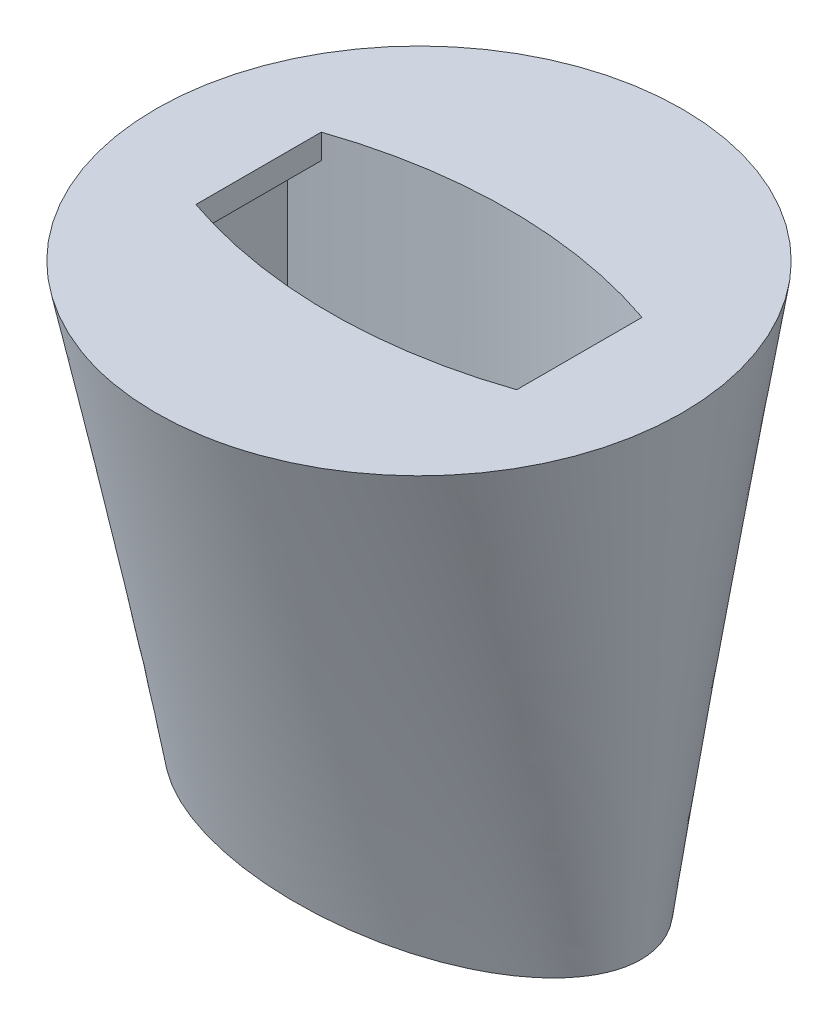
ISO-10303-21;
HEADER;
FILE_DESCRIPTION(('STEP AP214'),'2;1');
FILE_NAME('part.step','',(''),(''),'','','');
FILE_SCHEMA(('AUTOMOTIVE_DESIGN { 1 0 10303 214 1 1 1 1 }'));
ENDSEC;
DATA;
#1=APPLICATION_CONTEXT('core data for automotive mechanical design processes');
#2=APPLICATION_PROTOCOL_DEFINITION('international standard','automotive_design',2000,#1);
#3=PRODUCT_CONTEXT('',#1,'mechanical');
#4=PRODUCT('Part','Part','',(#3));
#5=PRODUCT_RELATED_PRODUCT_CATEGORY('part','',(#4));
#6=PRODUCT_DEFINITION_FORMATION('','',#4);
#7=PRODUCT_DEFINITION_CONTEXT('part definition',#1,'design');
#8=PRODUCT_DEFINITION('design','',#6,#7);
#9=PRODUCT_DEFINITION_SHAPE('','',#8);
#10=(LENGTH_UNIT() NAMED_UNIT(*) SI_UNIT(.MILLI.,.METRE.));
#11=(NAMED_UNIT(*) PLANE_ANGLE_UNIT() SI_UNIT($,.RADIAN.));
#12=(NAMED_UNIT(*) SI_UNIT($,.STERADIAN.) SOLID_ANGLE_UNIT());
#13=UNCERTAINTY_MEASURE_WITH_UNIT(LENGTH_MEASURE(1.E-05),#10,'distance_accuracy_value','');
#14=(GEOMETRIC_REPRESENTATION_CONTEXT(3) GLOBAL_UNCERTAINTY_ASSIGNED_CONTEXT((#13)) GLOBAL_UNIT_ASSIGNED_CONTEXT((#10,
#11,#12)) REPRESENTATION_CONTEXT('',''));
#15=CARTESIAN_POINT('',(0.,0.,0.));
#16=DIRECTION('',(0.,0.,1.));
#17=DIRECTION('',(1.,0.,0.));
#18=AXIS2_PLACEMENT_3D('',#15,#16,#17);
#19=CARTESIAN_POINT('',(0.,-38.946455480679,49.1214886532175));
#20=DIRECTION('',(0.,1.,0.));
#21=DIRECTION('',(0.,0.,1.));
#22=AXIS2_PLACEMENT_3D('',#19,#20,#21);
#23=CYLINDRICAL_SURFACE('',#22,60.);
#24=CARTESIAN_POINT('',(0.,57.053544519321,49.1214886532175));
#25=DIRECTION('',(0.,1.,0.));
#26=DIRECTION('',(0.,0.,1.));
#27=AXIS2_PLACEMENT_3D('',#24,#25,#26);
#28=CIRCLE('',#27,60.);
#29=CARTESIAN_POINT('',(19.5,57.053544519321,-7.62135230491574));
#30=VERTEX_POINT('',#29);
#31=CARTESIAN_POINT('',(22.5,57.053544519321,-6.5));
#32=VERTEX_POINT('',#31);
#33=EDGE_CURVE('E75',#30,#32,#28,.F.);
#34=ORIENTED_EDGE('',*,*,#33,.F.);
#35=DIRECTION('',(0.,1.,0.));
#36=VECTOR('',#35,1.);
#37=CARTESIAN_POINT('',(19.5,57.053544519321,-7.62135230491574));
#38=LINE('',#37,#36);
#39=CARTESIAN_POINT('',(19.5,60.053544519321,-7.62135230491574));
#40=VERTEX_POINT('',#39);
#41=EDGE_CURVE('E80',#30,#40,#38,.T.);
#42=ORIENTED_EDGE('',*,*,#41,.T.);
#43=CARTESIAN_POINT('',(0.,60.053544519321,49.1214886532175));
#44=DIRECTION('',(0.,-1.,0.));
#45=DIRECTION('',(0.,0.,-1.));
#46=AXIS2_PLACEMENT_3D('',#43,#44,#45);
#47=CIRCLE('',#46,60.);
#48=CARTESIAN_POINT('',(-19.5,60.053544519321,-7.62135230491574));
#49=VERTEX_POINT('',#48);
#50=EDGE_CURVE('E265',#49,#40,#47,.T.);
#51=ORIENTED_EDGE('',*,*,#50,.F.);
#52=DIRECTION('',(0.,1.,0.));
#53=VECTOR('',#52,1.);
#54=CARTESIAN_POINT('',(-19.5,57.053544519321,-7.62135230491574));
#55=LINE('',#54,#53);
#56=CARTESIAN_POINT('',(-19.5,57.053544519321,-7.62135230491574));
#57=VERTEX_POINT('',#56);
#58=EDGE_CURVE('E263',#57,#49,#55,.T.);
#59=ORIENTED_EDGE('',*,*,#58,.F.);
#60=CARTESIAN_POINT('',(0.,57.053544519321,49.1214886532175));
#61=DIRECTION('',(0.,1.,0.));
#62=DIRECTION('',(0.,0.,1.));
#63=AXIS2_PLACEMENT_3D('',#60,#61,#62);
#64=CIRCLE('',#63,60.);
#65=CARTESIAN_POINT('',(-22.5,57.053544519321,-6.5));
#66=VERTEX_POINT('',#65);
#67=EDGE_CURVE('E260',#66,#57,#64,.F.);
#68=ORIENTED_EDGE('',*,*,#67,.F.);
#69=DIRECTION('',(0.,1.,0.));
#70=VECTOR('',#69,1.);
#71=CARTESIAN_POINT('',(-22.5,-38.946455480679,-6.5));
#72=LINE('',#71,#70);
#73=CARTESIAN_POINT('',(-22.5,0.,-6.5));
#74=VERTEX_POINT('',#73);
#75=EDGE_CURVE('E143',#74,#66,#72,.T.);
#76=ORIENTED_EDGE('',*,*,#75,.F.);
#77=CARTESIAN_POINT('',(0.,0.,49.1214886532175));
#78=DIRECTION('',(0.,1.,0.));
#79=DIRECTION('',(0.,0.,1.));
#80=AXIS2_PLACEMENT_3D('',#77,#78,#79);
#81=CIRCLE('',#80,60.);
#82=CARTESIAN_POINT('',(22.5,0.,-6.5));
#83=VERTEX_POINT('',#82);
#84=EDGE_CURVE('E166',#74,#83,#81,.F.);
#85=ORIENTED_EDGE('',*,*,#84,.T.);
#86=DIRECTION('',(0.,1.,0.));
#87=VECTOR('',#86,1.);
#88=CARTESIAN_POINT('',(22.5,-38.946455480679,-6.5));
#89=LINE('',#88,#87);
#90=EDGE_CURVE('E154',#83,#32,#89,.T.);
#91=ORIENTED_EDGE('',*,*,#90,.T.);
#92=EDGE_LOOP('',(#34,#42,#51,#59,#68,#76,#85,#91));
#93=FACE_BOUND('',#92,.T.);
#94=ADVANCED_FACE('F56',(#93),#23,.F.);
#95=CARTESIAN_POINT('',(22.5,-38.946455480679,-6.5));
#96=DIRECTION('',(-1.,0.,0.));
#97=DIRECTION('',(0.,0.,1.));
#98=AXIS2_PLACEMENT_3D('',#95,#96,#97);
#99=PLANE('',#98);
#100=DIRECTION('',(0.,1.,0.));
#101=VECTOR('',#100,1.);
#102=CARTESIAN_POINT('',(22.5,-38.946455480679,6.5));
#103=LINE('',#102,#101);
#104=CARTESIAN_POINT('',(22.5,0.,6.5));
#105=VERTEX_POINT('',#104);
#106=CARTESIAN_POINT('',(22.5,57.053544519321,6.5));
#107=VERTEX_POINT('',#106);
#108=EDGE_CURVE('E151',#105,#107,#103,.T.);
#109=ORIENTED_EDGE('',*,*,#108,.T.);
#110=DIRECTION('',(0.,0.,1.));
#111=VECTOR('',#110,1.);
#112=CARTESIAN_POINT('',(22.5,57.053544519321,0.));
#113=LINE('',#112,#111);
#114=EDGE_CURVE('E273',#32,#107,#113,.T.);
#115=ORIENTED_EDGE('',*,*,#114,.F.);
#116=ORIENTED_EDGE('',*,*,#90,.F.);
#117=DIRECTION('',(0.,0.,1.));
#118=VECTOR('',#117,1.);
#119=CARTESIAN_POINT('',(22.5,0.,0.));
#120=LINE('',#119,#118);
#121=EDGE_CURVE('E164',#83,#105,#120,.T.);
#122=ORIENTED_EDGE('',*,*,#121,.T.);
#123=EDGE_LOOP('',(#109,#115,#116,#122));
#124=FACE_BOUND('',#123,.T.);
#125=ADVANCED_FACE('F216',(#124),#99,.T.);
#126=CARTESIAN_POINT('',(0.,-38.946455480679,-49.1214886532175));
#127=DIRECTION('',(0.,1.,0.));
#128=DIRECTION('',(0.,0.,1.));
#129=AXIS2_PLACEMENT_3D('',#126,#127,#128);
#130=CYLINDRICAL_SURFACE('',#129,60.);
#131=DIRECTION('',(0.,1.,0.));
#132=VECTOR('',#131,1.);
#133=CARTESIAN_POINT('',(19.5,57.053544519321,7.62135230491574));
#134=LINE('',#133,#132);
#135=CARTESIAN_POINT('',(19.5,57.053544519321,7.62135230491574));
#136=VERTEX_POINT('',#135);
#137=CARTESIAN_POINT('',(19.5,60.053544519321,7.62135230491574));
#138=VERTEX_POINT('',#137);
#139=EDGE_CURVE('E252',#136,#138,#134,.T.);
#140=ORIENTED_EDGE('',*,*,#139,.F.);
#141=CARTESIAN_POINT('',(0.,57.053544519321,-49.1214886532175));
#142=DIRECTION('',(0.,1.,0.));
#143=DIRECTION('',(0.,0.,1.));
#144=AXIS2_PLACEMENT_3D('',#141,#142,#143);
#145=CIRCLE('',#144,60.);
#146=EDGE_CURVE('E246',#136,#107,#145,.T.);
#147=ORIENTED_EDGE('',*,*,#146,.T.);
#148=ORIENTED_EDGE('',*,*,#108,.F.);
#149=CARTESIAN_POINT('',(0.,0.,-49.1214886532175));
#150=DIRECTION('',(0.,1.,0.));
#151=DIRECTION('',(0.,0.,1.));
#152=AXIS2_PLACEMENT_3D('',#149,#150,#151);
#153=CIRCLE('',#152,60.);
#154=CARTESIAN_POINT('',(-22.5,0.,6.5));
#155=VERTEX_POINT('',#154);
#156=EDGE_CURVE('E149',#155,#105,#153,.T.);
#157=ORIENTED_EDGE('',*,*,#156,.F.);
#158=DIRECTION('',(0.,1.,0.));
#159=VECTOR('',#158,1.);
#160=CARTESIAN_POINT('',(-22.5,-38.946455480679,6.5));
#161=LINE('',#160,#159);
#162=CARTESIAN_POINT('',(-22.5,57.053544519321,6.50000000000001));
#163=VERTEX_POINT('',#162);
#164=EDGE_CURVE('E140',#155,#163,#161,.T.);
#165=ORIENTED_EDGE('',*,*,#164,.T.);
#166=CARTESIAN_POINT('',(0.,57.053544519321,-49.1214886532175));
#167=DIRECTION('',(0.,1.,0.));
#168=DIRECTION('',(0.,0.,1.));
#169=AXIS2_PLACEMENT_3D('',#166,#167,#168);
#170=CIRCLE('',#169,60.);
#171=CARTESIAN_POINT('',(-19.5,57.053544519321,7.62135230491575));
#172=VERTEX_POINT('',#171);
#173=EDGE_CURVE('E126',#163,#172,#170,.T.);
#174=ORIENTED_EDGE('',*,*,#173,.T.);
#175=DIRECTION('',(0.,1.,0.));
#176=VECTOR('',#175,1.);
#177=CARTESIAN_POINT('',(-19.5,57.053544519321,7.62135230491575));
#178=LINE('',#177,#176);
#179=CARTESIAN_POINT('',(-19.5,60.053544519321,7.62135230491575));
#180=VERTEX_POINT('',#179);
#181=EDGE_CURVE('E261',#172,#180,#178,.T.);
#182=ORIENTED_EDGE('',*,*,#181,.T.);
#183=CARTESIAN_POINT('',(0.,60.053544519321,-49.1214886532175));
#184=DIRECTION('',(0.,1.,0.));
#185=DIRECTION('',(0.,0.,1.));
#186=AXIS2_PLACEMENT_3D('',#183,#184,#185);
#187=CIRCLE('',#186,60.);
#188=EDGE_CURVE('E156',#180,#138,#187,.T.);
#189=ORIENTED_EDGE('',*,*,#188,.T.);
#190=EDGE_LOOP('',(#140,#147,#148,#157,#165,#174,#182,#189));
#191=FACE_BOUND('',#190,.T.);
#192=ADVANCED_FACE('F146',(#191),#130,.F.);
#193=CARTESIAN_POINT('',(-22.5,-38.946455480679,6.50000000000001));
#194=DIRECTION('',(1.,0.,0.));
#195=DIRECTION('',(0.,0.,-1.));
#196=AXIS2_PLACEMENT_3D('',#193,#194,#195);
#197=PLANE('',#196);
#198=ORIENTED_EDGE('',*,*,#75,.T.);
#199=DIRECTION('',(0.,0.,-1.));
#200=VECTOR('',#199,1.);
#201=CARTESIAN_POINT('',(-22.5,57.053544519321,0.));
#202=LINE('',#201,#200);
#203=EDGE_CURVE('E129',#163,#66,#202,.T.);
#204=ORIENTED_EDGE('',*,*,#203,.F.);
#205=ORIENTED_EDGE('',*,*,#164,.F.);
#206=DIRECTION('',(0.,0.,-1.));
#207=VECTOR('',#206,1.);
#208=CARTESIAN_POINT('',(-22.5,0.,0.));
#209=LINE('',#208,#207);
#210=EDGE_CURVE('E161',#155,#74,#209,.T.);
#211=ORIENTED_EDGE('',*,*,#210,.T.);
#212=EDGE_LOOP('',(#198,#204,#205,#211));
#213=FACE_BOUND('',#212,.T.);
#214=ADVANCED_FACE('F139',(#213),#197,.T.);
#215=CARTESIAN_POINT('',(0.,0.,0.));
#216=DIRECTION('',(0.,1.,0.));
#217=DIRECTION('',(0.,0.,1.));
#218=AXIS2_PLACEMENT_3D('',#215,#216,#217);
#219=PLANE('',#218);
#220=CARTESIAN_POINT('',(-0.559362112920655,0.,14.9967806630334));
#221=CARTESIAN_POINT('',(-1.24645209964181,0.,14.9888712208033));
#222=CARTESIAN_POINT('',(-1.93337989539071,0.,14.9663953894342));
#223=CARTESIAN_POINT('',(-3.30577038116458,0.,14.8920737670603));
#224=CARTESIAN_POINT('',(-3.9912327911278,0.,14.8402227917329));
#225=CARTESIAN_POINT('',(-5.35939522091911,0.,14.7065895941069));
#226=CARTESIAN_POINT('',(-6.04209461566826,0.,14.6248009440789));
#227=CARTESIAN_POINT('',(-7.40294182534383,0.,14.4304412210879));
#228=CARTESIAN_POINT('',(-8.08109074386446,0.,14.3178779101248));
#229=CARTESIAN_POINT('',(-9.43118875261921,0.,14.0607355098812));
#230=CARTESIAN_POINT('',(-10.1031389498723,0.,13.9161622571956));
#231=CARTESIAN_POINT('',(-11.4387049804367,0.,13.5933700979005));
#232=CARTESIAN_POINT('',(-12.1023237335181,0.,13.4151633503389));
#233=CARTESIAN_POINT('',(-13.3427337079586,0.,13.0455957294498));
#234=CARTESIAN_POINT('',(-13.9206873228101,0.,12.8581423726115));
#235=CARTESIAN_POINT('',(-15.066003461428,0.,12.4533233195019));
#236=CARTESIAN_POINT('',(-15.6333672662892,0.,12.2359612683997));
#237=CARTESIAN_POINT('',(-16.754867742512,0.,11.76893942142));
#238=CARTESIAN_POINT('',(-17.3090012000136,0.,11.5192718707029));
#239=CARTESIAN_POINT('',(-18.4001364493073,0.,10.9848943300025));
#240=CARTESIAN_POINT('',(-18.9371410754442,0.,10.7001901758779));
#241=CARTESIAN_POINT('',(-19.8934762180852,0.,10.1475993090507));
#242=CARTESIAN_POINT('',(-20.3164625147834,0.,9.88605238036842));
#243=CARTESIAN_POINT('',(-21.1440766852847,0.,9.33507547300867));
#244=CARTESIAN_POINT('',(-21.548701767206,0.,9.04564127474036));
#245=CARTESIAN_POINT('',(-22.3340290202501,0.,8.43720694322864));
#246=CARTESIAN_POINT('',(-22.7147760565546,0.,8.11826522643579));
#247=CARTESIAN_POINT('',(-23.4466657492821,0.,7.44841026375293));
#248=CARTESIAN_POINT('',(-23.7978268671512,0.,7.09751724406021));
#249=CARTESIAN_POINT('',(-24.5336841431835,0.,6.28306339809126));
#250=CARTESIAN_POINT('',(-24.9096713982407,0.,5.81139874564567));
#251=CARTESIAN_POINT('',(-25.4177860956065,0.,5.06636834517155));
#252=CARTESIAN_POINT('',(-25.57781899979,0.,4.81182646142027));
#253=CARTESIAN_POINT('',(-25.8766251461491,0.,4.29047581322053));
#254=CARTESIAN_POINT('',(-26.01540180364,0.,4.02366902839187));
#255=CARTESIAN_POINT('',(-26.2481916203661,0.,3.52296625575908));
#256=CARTESIAN_POINT('',(-26.3458143893527,0.,3.29074637860708));
#257=CARTESIAN_POINT('',(-26.5223507621801,0.,2.81928164478027));
#258=CARTESIAN_POINT('',(-26.6012661432372,0.,2.58003745784906));
#259=CARTESIAN_POINT('',(-26.7387653923172,0.,2.09591348855754));
#260=CARTESIAN_POINT('',(-26.7973620951395,0.,1.85103736838546));
#261=CARTESIAN_POINT('',(-26.8929883717465,0.,1.35708632572088));
#262=CARTESIAN_POINT('',(-26.9300179205211,0.,1.10801139835964));
#263=CARTESIAN_POINT('',(-26.9817278981205,0.,0.606457379060271));
#264=CARTESIAN_POINT('',(-26.9963116872423,0.,0.35396826276007));
#265=CARTESIAN_POINT('',(-27.0024559716731,0.,-0.151292246845516));
#266=CARTESIAN_POINT('',(-26.9940164030581,0.,-0.404063640932692));
#267=CARTESIAN_POINT('',(-26.9543249091982,0.,-0.907855798829123));
#268=CARTESIAN_POINT('',(-26.9230677799681,0.,-1.15887615009228));
#269=CARTESIAN_POINT('',(-26.8385046569608,0.,-1.65715649324618));
#270=CARTESIAN_POINT('',(-26.785198779518,0.,-1.90441650497022));
#271=CARTESIAN_POINT('',(-26.6616739331251,0.,-2.37849993024359));
#272=CARTESIAN_POINT('',(-26.5926901977114,0.,-2.605647756982));
#273=CARTESIAN_POINT('',(-26.4376551444202,0.,-3.05400129891548));
#274=CARTESIAN_POINT('',(-26.3516050389947,0.,-3.27520743496122));
#275=CARTESIAN_POINT('',(-26.1638405413648,0.,-3.71084514920797));
#276=CARTESIAN_POINT('',(-26.062126098229,0.,-3.92527670537914));
#277=CARTESIAN_POINT('',(-25.8444438151982,0.,-4.34686902815832));
#278=CARTESIAN_POINT('',(-25.7284688964317,0.,-4.55402611761009));
#279=CARTESIAN_POINT('',(-25.4132781091452,0.,-5.07763040186659));
#280=CARTESIAN_POINT('',(-25.2045584754401,0.,-5.38838804677526));
#281=CARTESIAN_POINT('',(-24.7604678642913,0.,-5.99028139642021));
#282=CARTESIAN_POINT('',(-24.5250821578808,0.,-6.28140611392712));
#283=CARTESIAN_POINT('',(-24.0316374497551,0.,-6.84482084193496));
#284=CARTESIAN_POINT('',(-23.7735284467791,0.,-7.11706683460441));
#285=CARTESIAN_POINT('',(-23.2388654565999,0.,-7.64268427857842));
#286=CARTESIAN_POINT('',(-22.9623120452145,0.,-7.8960563185884));
#287=CARTESIAN_POINT('',(-22.4470091584503,0.,-8.33912835531124));
#288=CARTESIAN_POINT('',(-22.2108613355209,0.,-8.53187476618393));
#289=CARTESIAN_POINT('',(-21.7297508777696,0.,-8.90604508857546));
#290=CARTESIAN_POINT('',(-21.484787314113,0.,-9.08746780148004));
#291=CARTESIAN_POINT('',(-20.7382437951319,0.,-9.61569404826989));
#292=CARTESIAN_POINT('',(-20.2251551254608,0.,-9.94633372822728));
#293=CARTESIAN_POINT('',(-19.1751056877688,0.,-10.5687875324921));
#294=CARTESIAN_POINT('',(-18.6381072112187,0.,-10.8605372045812));
#295=CARTESIAN_POINT('',(-17.5462648492455,0.,-11.4081033339115));
#296=CARTESIAN_POINT('',(-16.9914229931053,0.,-11.6639238596485));
#297=CARTESIAN_POINT('',(-15.7874493123146,0.,-12.1768274610379));
#298=CARTESIAN_POINT('',(-15.1361757830251,0.,-12.428864498882));
#299=CARTESIAN_POINT('',(-13.8194134262149,0.,-12.8935859749743));
#300=CARTESIAN_POINT('',(-13.153916487135,0.,-13.1062472511985));
#301=CARTESIAN_POINT('',(-11.812183102718,0.,-13.4949099643659));
#302=CARTESIAN_POINT('',(-11.1359440950646,0.,-13.6709025089516));
#303=CARTESIAN_POINT('',(-9.77451733745036,0.,-13.9885823005385));
#304=CARTESIAN_POINT('',(-9.0893185692816,0.,-14.1302220832857));
#305=CARTESIAN_POINT('',(-7.71317587295859,0.,-14.3805306023812));
#306=CARTESIAN_POINT('',(-7.0222337950266,0.,-14.4892095641287));
#307=CARTESIAN_POINT('',(-5.63614353451545,0.,-14.6748934098944));
#308=CARTESIAN_POINT('',(-4.9409955223648,0.,-14.7518995687178));
#309=CARTESIAN_POINT('',(-3.68851253475271,0.,-14.8626607808144));
#310=CARTESIAN_POINT('',(-3.13166287238362,0.,-14.9020068833493));
#311=CARTESIAN_POINT('',(-2.01689771264321,0.,-14.9613254573178));
#312=CARTESIAN_POINT('',(-1.45898215899125,0.,-14.9812968757286));
#313=CARTESIAN_POINT('',(-0.34271211946394,0.,-15.0020004176685));
#314=CARTESIAN_POINT('',(0.21564242029934,0.,-15.0027296120518));
#315=CARTESIAN_POINT('',(1.33204482900506,0.,-14.9849461701837));
#316=CARTESIAN_POINT('',(1.89009269873737,0.,-14.9664335837261));
#317=CARTESIAN_POINT('',(3.00461095160075,0.,-14.9100708545392));
#318=CARTESIAN_POINT('',(3.5610823865408,0.,-14.8722415676705));
#319=CARTESIAN_POINT('',(4.67230113265084,0.,-14.7770011090791));
#320=CARTESIAN_POINT('',(5.22704859127439,0.,-14.7195916613368));
#321=CARTESIAN_POINT('',(6.33399982754458,0.,-14.5848035735417));
#322=CARTESIAN_POINT('',(6.8862041370104,0.,-14.5074293213101));
#323=CARTESIAN_POINT('',(7.98730690953988,0.,-14.3321582531872));
#324=CARTESIAN_POINT('',(8.53620555989781,0.,-14.2342626114812));
#325=CARTESIAN_POINT('',(9.84780175092005,0.,-13.9739690570845));
#326=CARTESIAN_POINT('',(10.6085191396145,0.,-13.8014138035984));
#327=CARTESIAN_POINT('',(12.1186396095266,0.,-13.4121690386418));
#328=CARTESIAN_POINT('',(12.8680421952691,0.,-13.1954776004345));
#329=CARTESIAN_POINT('',(14.3511653252418,0.,-12.7145920726243));
#330=CARTESIAN_POINT('',(15.0848951262709,0.,-12.4504269419708));
#331=CARTESIAN_POINT('',(16.1696472506697,0.,-12.0151785510873));
#332=CARTESIAN_POINT('',(16.5285663961811,0.,-11.8636075624435));
#333=CARTESIAN_POINT('',(17.2402839313435,0.,-11.5467464538674));
#334=CARTESIAN_POINT('',(17.5930827846757,0.,-11.3814573787713));
#335=CARTESIAN_POINT('',(18.4066677524945,0.,-10.9795106848386));
#336=CARTESIAN_POINT('',(18.8647254425234,0.,-10.7372846485412));
#337=CARTESIAN_POINT('',(19.7651999899225,0.,-10.2251218924592));
#338=CARTESIAN_POINT('',(20.2076157678793,0.,-9.95518326528859));
#339=CARTESIAN_POINT('',(21.0722166789819,0.,-9.38561537050671));
#340=CARTESIAN_POINT('',(21.4944264781273,0.,-9.08602374749345));
#341=CARTESIAN_POINT('',(22.3138203210137,0.,-8.45438385663093));
#342=CARTESIAN_POINT('',(22.7110153621268,0.,-8.12235001766773));
#343=CARTESIAN_POINT('',(23.3425397937162,0.,-7.5432721205285));
#344=CARTESIAN_POINT('',(23.5859915746318,0.,-7.30615425079658));
#345=CARTESIAN_POINT('',(24.0565830389993,0.,-6.81616286778321));
#346=CARTESIAN_POINT('',(24.2837230618723,0.,-6.56328968254879));
#347=CARTESIAN_POINT('',(24.7184689757946,0.,-6.04164242824222));
#348=CARTESIAN_POINT('',(24.9260944470242,0.,-5.77288474793179));
#349=CARTESIAN_POINT('',(25.3185289691347,0.,-5.21922546882372));
#350=CARTESIAN_POINT('',(25.5033469694268,0.,-4.9343302666548));
#351=CARTESIAN_POINT('',(25.8083479280371,0.,-4.41362396949968));
#352=CARTESIAN_POINT('',(25.933786614977,0.,-4.18088849574186));
#353=CARTESIAN_POINT('',(26.1664292139121,0.,-3.70658224381032));
#354=CARTESIAN_POINT('',(26.2736432035289,0.,-3.46501643888856));
#355=CARTESIAN_POINT('',(26.4678667600081,0.,-2.97399292759514));
#356=CARTESIAN_POINT('',(26.5548861235645,0.,-2.72453911482323));
#357=CARTESIAN_POINT('',(26.7069179036934,0.,-2.21897614624258));
#358=CARTESIAN_POINT('',(26.7719303065358,0.,-1.96286698628167));
#359=CARTESIAN_POINT('',(26.8787773196192,0.,-1.44380688223765));
#360=CARTESIAN_POINT('',(26.920432813879,0.,-1.18081883018862));
#361=CARTESIAN_POINT('',(26.9786889783716,0.,-0.652065797089806));
#362=CARTESIAN_POINT('',(26.995289747259,0.,-0.386300826978455));
#363=CARTESIAN_POINT('',(27.0029714865466,0.,0.145556271606373));
#364=CARTESIAN_POINT('',(26.9940564490631,0.,0.411648342391701));
#365=CARTESIAN_POINT('',(26.9509640897407,0.,0.941760598908144));
#366=CARTESIAN_POINT('',(26.9167880898416,0.,1.20578089232748));
#367=CARTESIAN_POINT('',(26.8292350752315,0.,1.70056037160788));
#368=CARTESIAN_POINT('',(26.7783935157307,0.,1.9317744849901));
#369=CARTESIAN_POINT('',(26.6584969445152,0.,2.38938855083706));
#370=CARTESIAN_POINT('',(26.5894439753269,0.,2.61578904010538));
#371=CARTESIAN_POINT('',(26.4343642282829,0.,3.06273242692908));
#372=CARTESIAN_POINT('',(26.348333689312,0.,3.28327401423068));
#373=CARTESIAN_POINT('',(26.1606960483851,0.,3.71764735474477));
#374=CARTESIAN_POINT('',(26.0590852533996,0.,3.93147750261229));
#375=CARTESIAN_POINT('',(25.7918666861394,0.,4.44823213388481));
#376=CARTESIAN_POINT('',(25.6182784499913,0.,4.74704974825986));
#377=CARTESIAN_POINT('',(25.2453486019069,0.,5.32815271856426));
#378=CARTESIAN_POINT('',(25.045996638843,0.,5.61043136299824));
#379=CARTESIAN_POINT('',(24.6251043170295,0.,6.1587181350969));
#380=CARTESIAN_POINT('',(24.4035219596224,0.,6.42469387596735));
#381=CARTESIAN_POINT('',(23.9419447174361,0.,6.94003596174454));
#382=CARTESIAN_POINT('',(23.7019498025682,0.,7.18940227950799));
#383=CARTESIAN_POINT('',(23.0620124938013,0.,7.81283063203886));
#384=CARTESIAN_POINT('',(22.65034855221,0.,8.17489408242371));
#385=CARTESIAN_POINT('',(21.7971362181885,0.,8.86193148091591));
#386=CARTESIAN_POINT('',(21.3555700238599,0.,9.18688302017549));
#387=CARTESIAN_POINT('',(20.448471661569,0.,9.80322243005061));
#388=CARTESIAN_POINT('',(19.9828942976989,0.,10.0945433945628));
#389=CARTESIAN_POINT('',(19.0336505670952,0.,10.6456872882466));
#390=CARTESIAN_POINT('',(18.5499861009497,0.,10.9055135147758));
#391=CARTESIAN_POINT('',(17.4940275747258,0.,11.4333406668218));
#392=CARTESIAN_POINT('',(16.9193892333378,0.,11.6966385248505));
#393=CARTESIAN_POINT('',(15.7550373474337,0.,12.1882567979193));
#394=CARTESIAN_POINT('',(15.1653148278526,0.,12.4165557959015));
#395=CARTESIAN_POINT('',(13.9741823856023,0.,12.84069901171));
#396=CARTESIAN_POINT('',(13.372769259382,0.,13.03653418938));
#397=CARTESIAN_POINT('',(12.1607701056365,0.,13.3978614727098));
#398=CARTESIAN_POINT('',(11.5501817363664,0.,13.5633456847079));
#399=CARTESIAN_POINT('',(10.3221910695405,0.,13.8655709072689));
#400=CARTESIAN_POINT('',(9.70479125803333,0.,14.002322061922));
#401=CARTESIAN_POINT('',(8.46469075194134,0.,14.2484832555183));
#402=CARTESIAN_POINT('',(7.84199092368094,0.,14.3578976773427));
#403=CARTESIAN_POINT('',(6.57442318977098,0.,14.553244166906));
#404=CARTESIAN_POINT('',(5.92943638059479,0.,14.6384026302233));
#405=CARTESIAN_POINT('',(4.63639687679878,0.,14.7817297203362));
#406=CARTESIAN_POINT('',(3.98834378523586,0.,14.8398947504753));
#407=CARTESIAN_POINT('',(2.69065954504781,0.,14.9297502551422));
#408=CARTESIAN_POINT('',(2.04102909467078,0.,14.9614508454734));
#409=CARTESIAN_POINT('',(0.741096595536636,0.,14.9987067338233));
#410=CARTESIAN_POINT('',(0.090794629778548,0.,15.0042649479106));
#411=CARTESIAN_POINT('',(-0.559362112920655,0.,14.9967806630334));
#412=B_SPLINE_CURVE_WITH_KNOTS('',3,(#220,#221,#222,#223,#224,#225,#226,#227,#228,#229,#230,
#231,#232,#233,#234,#235,#236,#237,#238,#239,#240,#241,#242,#243,#244,#245,#246,#247,#248,#249,
#250,#251,#252,#253,#254,#255,#256,#257,#258,#259,#260,#261,#262,#263,#264,#265,#266,#267,#268,
#269,#270,#271,#272,#273,#274,#275,#276,#277,#278,#279,#280,#281,#282,#283,#284,#285,#286,#287,
#288,#289,#290,#291,#292,#293,#294,#295,#296,#297,#298,#299,#300,#301,#302,#303,#304,#305,#306,
#307,#308,#309,#310,#311,#312,#313,#314,#315,#316,#317,#318,#319,#320,#321,#322,#323,#324,#325,
#326,#327,#328,#329,#330,#331,#332,#333,#334,#335,#336,#337,#338,#339,#340,#341,#342,#343,#344,
#345,#346,#347,#348,#349,#350,#351,#352,#353,#354,#355,#356,#357,#358,#359,#360,#361,#362,#363,
#364,#365,#366,#367,#368,#369,#370,#371,#372,#373,#374,#375,#376,#377,#378,#379,#380,#381,#382,
#383,#384,#385,#386,#387,#388,#389,#390,#391,#392,#393,#394,#395,#396,#397,#398,#399,#400,#401,
#402,#403,#404,#405,#406,#407,#408,#409,#410,#411),.UNSPECIFIED.,.T.,.F.,(4,2,2,2,2,2,2,2,2,2,2,
2,2,2,2,2,2,2,2,2,2,2,2,2,2,2,2,2,2,2,2,2,2,2,2,2,2,2,2,2,2,2,2,2,2,2,2,2,2,2,2,2,2,2,2,2,2,2,2,
2,2,2,2,2,2,2,2,2,2,2,2,2,2,2,2,2,2,2,2,2,2,2,2,2,2,2,2,2,2,2,2,2,2,2,2,4),(0.,2.06125936930016,
4.12288263687386,6.18494880247351,8.24649535179219,10.307666314126,12.3680935524891,
14.1901285527288,16.0119416859623,17.8341929541794,19.6561411095677,21.1471246357784,
22.6383341163414,24.1266521460557,25.614034487195,27.4172023537155,28.3184094293063,
29.2194715525749,29.9744676992299,30.7293920919049,31.4838387453532,32.2382862736864,
32.9959730607061,33.7536619514307,34.5115237017433,35.2693814534523,35.9808421967523,
36.6922524136024,37.4036649436047,38.1154320539083,39.2366862108946,40.3585627387068,
41.4829727279122,42.6073476304723,43.5214611326894,44.4356712303669,46.2646557582299,
48.0966347345785,49.9284060962331,52.022001215043,54.1168239648468,56.2121541302654,
58.3103630699095,60.4079204171033,62.505393331013,64.1797828317188,65.8542633311531,
67.5289987267642,69.2037297885003,70.8766564873547,72.5494359275274,74.2218480405543,
75.8941644882134,78.2329937486047,80.5719251309832,82.9094345785078,84.0780264004271,
85.2465292982443,86.8001174024072,88.3538125078039,89.9055598908284,91.4566202387261,
92.475512299501,93.4943831526466,94.5122205440937,95.5296572683057,96.3221260903913,
97.1141552692158,97.9057994167217,98.6974440581334,99.495079305464,100.292711412048,
101.090218730647,101.887684317577,102.597135923577,103.306507993845,104.016037391183,
104.725735230892,105.760861149372,106.796404252266,107.833941970647,108.87148138454,
110.513526947321,112.156558822834,113.802805049958,115.448878773368,117.343817337246,
119.239910892691,121.136531567013,123.033644816029,124.930087167259,126.826225267673,
128.777389423691,130.728813481961,132.679491283275,134.629951489802),.UNSPECIFIED.);
#413=CARTESIAN_POINT('',(0.559362112920651,0.,-14.9967806630334));
#414=VERTEX_POINT('',#413);
#415=EDGE_CURVE('E12',#414,#414,#412,.F.);
#416=ORIENTED_EDGE('',*,*,#415,.F.);
#417=EDGE_LOOP('',(#416));
#418=FACE_BOUND('',#417,.T.);
#419=ORIENTED_EDGE('',*,*,#84,.F.);
#420=ORIENTED_EDGE('',*,*,#210,.F.);
#421=ORIENTED_EDGE('',*,*,#156,.T.);
#422=ORIENTED_EDGE('',*,*,#121,.F.);
#423=EDGE_LOOP('',(#419,#420,#421,#422));
#424=FACE_BOUND('',#423,.T.);
#425=ADVANCED_FACE('F58',(#418,#424),#219,.F.);
#426=CARTESIAN_POINT('',(0.,60.053544519321,0.));
#427=DIRECTION('',(0.,1.,0.));
#428=DIRECTION('',(0.,0.,1.));
#429=AXIS2_PLACEMENT_3D('',#426,#427,#428);
#430=PLANE('',#429);
#431=DIRECTION('',(0.,0.,-1.));
#432=VECTOR('',#431,1.);
#433=CARTESIAN_POINT('',(-19.5,60.053544519321,0.));
#434=LINE('',#433,#432);
#435=EDGE_CURVE('E144',#180,#49,#434,.T.);
#436=ORIENTED_EDGE('',*,*,#435,.T.);
#437=ORIENTED_EDGE('',*,*,#50,.T.);
#438=DIRECTION('',(0.,0.,-1.));
#439=VECTOR('',#438,1.);
#440=CARTESIAN_POINT('',(19.5,60.053544519321,0.));
#441=LINE('',#440,#439);
#442=EDGE_CURVE('E248',#138,#40,#441,.T.);
#443=ORIENTED_EDGE('',*,*,#442,.F.);
#444=ORIENTED_EDGE('',*,*,#188,.F.);
#445=EDGE_LOOP('',(#436,#437,#443,#444));
#446=FACE_BOUND('',#445,.T.);
#447=CARTESIAN_POINT('',(0.,60.053544519321,0.));
#448=DIRECTION('',(0.,1.,0.));
#449=DIRECTION('',(0.,0.,1.));
#450=AXIS2_PLACEMENT_3D('',#447,#448,#449);
#451=CIRCLE('',#450,32.);
#452=CARTESIAN_POINT('',(0.162188065057829,60.053544519321,-31.9995889822284));
#453=VERTEX_POINT('',#452);
#454=EDGE_CURVE('E68',#453,#453,#451,.T.);
#455=ORIENTED_EDGE('',*,*,#454,.T.);
#456=EDGE_LOOP('',(#455));
#457=FACE_BOUND('',#456,.T.);
#458=ADVANCED_FACE('F188',(#446,#457),#430,.T.);
#459=CARTESIAN_POINT('',(0.559362112920651,0.,-14.9967806630334));
#460=CARTESIAN_POINT('',(0.162188065057829,60.053544519321,-31.9995889822284));
#461=CARTESIAN_POINT('',(-53.4290482739996,0.,-15.6182941218341));
#462=CARTESIAN_POINT('',(-63.8369898993989,60.053544519321,-32.323965112344));
#463=CARTESIAN_POINT('',(-54.5477724998409,0.,14.3752672042327));
#464=CARTESIAN_POINT('',(-64.1613660295146,60.053544519321,31.6752128521127));
#465=CARTESIAN_POINT('',(-0.559362112920655,0.,14.9967806630334));
#466=CARTESIAN_POINT('',(-0.162188065057833,60.053544519321,31.9995889822284));
#467=CARTESIAN_POINT('',(53.4290482739996,0.,15.6182941218341));
#468=CARTESIAN_POINT('',(63.8369898993989,60.053544519321,32.3239651123441));
#469=CARTESIAN_POINT('',(54.5477724998409,0.,-14.3752672042327));
#470=CARTESIAN_POINT('',(64.1613660295146,60.053544519321,-31.6752128521127));
#471=CARTESIAN_POINT('',(0.559362112920651,0.,-14.9967806630334));
#472=CARTESIAN_POINT('',(0.162188065057829,60.053544519321,-31.9995889822284));
#473=(BOUNDED_SURFACE() B_SPLINE_SURFACE(3,1,((#459,#460),(#461,#462),(#463,#464),(#465,#466),
(#467,#468),(#469,#470),(#471,#472)),.UNSPECIFIED.,.T.,.F.,.F.) B_SPLINE_SURFACE_WITH_KNOTS((4,
3,4),(2,2),(0.,0.5,1.),(0.,1.),
.UNSPECIFIED.) GEOMETRIC_REPRESENTATION_ITEM() RATIONAL_B_SPLINE_SURFACE(((1.,1.),
(0.333333333333333,0.333333333333333),(0.333333333333333,0.333333333333333),(1.,1.),
(0.333333333333333,0.333333333333333),(0.333333333333333,0.333333333333333),(1.,1.))) REPRESENTATION_ITEM('') SURFACE());
#474=CARTESIAN_POINT('',(0.559362112920651,0.,-14.9967806630334));
#475=CARTESIAN_POINT('',(0.555224883255414,0.625557755409594,-15.1738932496917));
#476=CARTESIAN_POINT('',(0.551087653590176,1.25111551081919,-15.35100583635));
#477=CARTESIAN_POINT('',(0.542813194259701,2.50223102163838,-15.7052310096665));
#478=CARTESIAN_POINT('',(0.538675964594463,3.12778877704797,-15.8823435963248));
#479=CARTESIAN_POINT('',(0.530401505263987,4.37890428786716,-16.2365687696414));
#480=CARTESIAN_POINT('',(0.52626427559875,5.00446204327675,-16.4136813562996));
#481=CARTESIAN_POINT('',(0.517989816268274,6.25557755409594,-16.7679065296162));
#482=CARTESIAN_POINT('',(0.513852586603036,6.88113530950553,-16.9450191162745));
#483=CARTESIAN_POINT('',(0.505578127272561,8.13225082032472,-17.2992442895911));
#484=CARTESIAN_POINT('',(0.501440897607323,8.75780857573431,-17.4763568762493));
#485=CARTESIAN_POINT('',(0.493166438276848,10.0089240865535,-17.8305820495659));
#486=CARTESIAN_POINT('',(0.48902920861161,10.6344818419631,-18.0076946362242));
#487=CARTESIAN_POINT('',(0.480754749281134,11.8855973527823,-18.3619198095407));
#488=CARTESIAN_POINT('',(0.476617519615897,12.5111551081919,-18.539032396199));
#489=CARTESIAN_POINT('',(0.468343060285421,13.7622706190111,-18.8932575695156));
#490=CARTESIAN_POINT('',(0.464205830620183,14.3878283744207,-19.0703701561739));
#491=CARTESIAN_POINT('',(0.455931371289708,15.6389438852398,-19.4245953294904));
#492=CARTESIAN_POINT('',(0.45179414162447,16.2645016406494,-19.6017079161487));
#493=CARTESIAN_POINT('',(0.443519682293995,17.5156171514686,-19.9559330894653));
#494=CARTESIAN_POINT('',(0.439382452628757,18.1411749068782,-20.1330456761236));
#495=CARTESIAN_POINT('',(0.431107993298282,19.3922904176974,-20.4872708494401));
#496=CARTESIAN_POINT('',(0.426970763633044,20.017848173107,-20.6643834360984));
#497=CARTESIAN_POINT('',(0.418696304302568,21.2689636839262,-21.018608609415));
#498=CARTESIAN_POINT('',(0.414559074637331,21.8945214393358,-21.1957211960732));
#499=CARTESIAN_POINT('',(0.406284615306855,23.145636950155,-21.5499463693898));
#500=CARTESIAN_POINT('',(0.402147385641617,23.7711947055646,-21.7270589560481));
#501=CARTESIAN_POINT('',(0.393872926311142,25.0223102163838,-22.0812841293646));
#502=CARTESIAN_POINT('',(0.389735696645904,25.6478679717934,-22.2583967160229));
#503=CARTESIAN_POINT('',(0.381461237315429,26.8989834826125,-22.6126218893395));
#504=CARTESIAN_POINT('',(0.377324007650191,27.5245412380221,-22.7897344759978));
#505=CARTESIAN_POINT('',(0.369049548319715,28.7756567488413,-23.1439596493143));
#506=CARTESIAN_POINT('',(0.364912318654478,29.4012145042509,-23.3210722359726));
#507=CARTESIAN_POINT('',(0.356637859324002,30.6523300150701,-23.6752974092892));
#508=CARTESIAN_POINT('',(0.352500629658765,31.2778877704797,-23.8524099959475));
#509=CARTESIAN_POINT('',(0.344226170328289,32.5290032812989,-24.206635169264));
#510=CARTESIAN_POINT('',(0.340088940663051,33.1545610367085,-24.3837477559223));
#511=CARTESIAN_POINT('',(0.331814481332576,34.4056765475277,-24.7379729292389));
#512=CARTESIAN_POINT('',(0.327677251667338,35.0312343029373,-24.9150855158971));
#513=CARTESIAN_POINT('',(0.319402792336863,36.2823498137564,-25.2693106892137));
#514=CARTESIAN_POINT('',(0.315265562671625,36.907907569166,-25.446423275872));
#515=CARTESIAN_POINT('',(0.306991103341149,38.1590230799852,-25.8006484491885));
#516=CARTESIAN_POINT('',(0.302853873675912,38.7845808353948,-25.9777610358468));
#517=CARTESIAN_POINT('',(0.294579414345436,40.035696346214,-26.3319862091634));
#518=CARTESIAN_POINT('',(0.290442184680199,40.6612541016236,-26.5090987958217));
#519=CARTESIAN_POINT('',(0.282167725349723,41.9123696124428,-26.8633239691382));
#520=CARTESIAN_POINT('',(0.278030495684485,42.5379273678524,-27.0404365557965));
#521=CARTESIAN_POINT('',(0.26975603635401,43.7890428786716,-27.3946617291131));
#522=CARTESIAN_POINT('',(0.265618806688772,44.4146006340812,-27.5717743157714));
#523=CARTESIAN_POINT('',(0.257344347358297,45.6657161449004,-27.9259994890879));
#524=CARTESIAN_POINT('',(0.253207117693059,46.29127390031,-28.1031120757462));
#525=CARTESIAN_POINT('',(0.244932658362583,47.5423894111291,-28.4573372490628));
#526=CARTESIAN_POINT('',(0.240795428697346,48.1679471665387,-28.634449835721));
#527=CARTESIAN_POINT('',(0.23252096936687,49.4190626773579,-28.9886750090376));
#528=CARTESIAN_POINT('',(0.228383739701632,50.0446204327675,-29.1657875956959));
#529=CARTESIAN_POINT('',(0.220109280371157,51.2957359435867,-29.5200127690125));
#530=CARTESIAN_POINT('',(0.215972050705919,51.9212936989963,-29.6971253556707));
#531=CARTESIAN_POINT('',(0.207697591375444,53.1724092098155,-30.0513505289873));
#532=CARTESIAN_POINT('',(0.203560361710206,53.7979669652251,-30.2284631156456));
#533=CARTESIAN_POINT('',(0.195285902379731,55.0490824760443,-30.5826882889621));
#534=CARTESIAN_POINT('',(0.191148672714493,55.6746402314539,-30.7598008756204));
#535=CARTESIAN_POINT('',(0.182874213384017,56.925755742273,-31.114026048937));
#536=CARTESIAN_POINT('',(0.17873698371878,57.5513134976826,-31.2911386355953));
#537=CARTESIAN_POINT('',(0.170462524388304,58.8024290085018,-31.6453638089118));
#538=CARTESIAN_POINT('',(0.166325294723066,59.4279867639114,-31.8224763955701));
#539=CARTESIAN_POINT('',(0.162188065057829,60.053544519321,-31.9995889822284));
#540=B_SPLINE_CURVE_WITH_KNOTS('',3,(#474,#475,#476,#477,#478,#479,#480,#481,#482,#483,#484,
#485,#486,#487,#488,#489,#490,#491,#492,#493,#494,#495,#496,#497,#498,#499,#500,#501,#502,#503,
#504,#505,#506,#507,#508,#509,#510,#511,#512,#513,#514,#515,#516,#517,#518,#519,#520,#521,#522,
#523,#524,#525,#526,#527,#528,#529,#530,#531,#532,#533,#534,#535,#536,#537,#538,#539),
.UNSPECIFIED.,.F.,.F.,(4,2,2,2,2,2,2,2,2,2,2,2,2,2,2,2,2,2,2,2,2,2,2,2,2,2,2,2,2,2,2,2,4),(0.,
1.95048107229386,3.90096214458772,5.85144321688159,7.80192428917545,9.75240536146931,
11.7028864337632,13.653367506057,15.6038485783509,17.5543296506448,19.5048107229386,
21.4552917952325,23.4057728675263,25.3562539398202,27.3067350121141,29.2572160844079,
31.2076971567018,33.1581782289957,35.1086593012895,37.0591403735834,39.0096214458772,
40.9601025181711,42.910583590465,44.8610646627588,46.8115457350527,48.7620268073465,
50.7125078796404,52.6629889519343,54.6134700242281,56.563951096522,58.5144321688158,
60.4649132411097,62.4153943134036),.UNSPECIFIED.);
#541=EDGE_CURVE('BSEAM176',#414,#453,#540,.T.);
#542=ORIENTED_EDGE('',*,*,#415,.T.);
#543=ORIENTED_EDGE('',*,*,#454,.F.);
#544=ORIENTED_EDGE('',*,*,#541,.T.);
#545=ORIENTED_EDGE('',*,*,#541,.F.);
#546=EDGE_LOOP('',(#542,#544,#543,#545));
#547=FACE_BOUND('',#546,.T.);
#548=ADVANCED_FACE('F176',(#547),#473,.T.);
#549=CARTESIAN_POINT('',(-19.5,57.053544519321,0.));
#550=DIRECTION('',(1.,0.,0.));
#551=DIRECTION('',(0.,0.,-1.));
#552=AXIS2_PLACEMENT_3D('',#549,#550,#551);
#553=PLANE('',#552);
#554=ORIENTED_EDGE('',*,*,#435,.F.);
#555=ORIENTED_EDGE('',*,*,#181,.F.);
#556=DIRECTION('',(0.,0.,-1.));
#557=VECTOR('',#556,1.);
#558=CARTESIAN_POINT('',(-19.5,57.053544519321,0.));
#559=LINE('',#558,#557);
#560=EDGE_CURVE('E132',#172,#57,#559,.T.);
#561=ORIENTED_EDGE('',*,*,#560,.T.);
#562=ORIENTED_EDGE('',*,*,#58,.T.);
#563=EDGE_LOOP('',(#554,#555,#561,#562));
#564=FACE_BOUND('',#563,.T.);
#565=ADVANCED_FACE('F187',(#564),#553,.T.);
#566=CARTESIAN_POINT('',(0.,57.053544519321,0.));
#567=DIRECTION('',(0.,1.,0.));
#568=DIRECTION('',(0.,0.,1.));
#569=AXIS2_PLACEMENT_3D('',#566,#567,#568);
#570=PLANE('',#569);
#571=ORIENTED_EDGE('',*,*,#203,.T.);
#572=ORIENTED_EDGE('',*,*,#67,.T.);
#573=ORIENTED_EDGE('',*,*,#560,.F.);
#574=ORIENTED_EDGE('',*,*,#173,.F.);
#575=EDGE_LOOP('',(#571,#572,#573,#574));
#576=FACE_BOUND('',#575,.T.);
#577=ADVANCED_FACE('F128',(#576),#570,.F.);
#578=CARTESIAN_POINT('',(19.5,57.053544519321,0.));
#579=DIRECTION('',(1.,0.,0.));
#580=DIRECTION('',(0.,0.,-1.));
#581=AXIS2_PLACEMENT_3D('',#578,#579,#580);
#582=PLANE('',#581);
#583=ORIENTED_EDGE('',*,*,#442,.T.);
#584=ORIENTED_EDGE('',*,*,#41,.F.);
#585=DIRECTION('',(0.,0.,-1.));
#586=VECTOR('',#585,1.);
#587=CARTESIAN_POINT('',(19.5,57.053544519321,0.));
#588=LINE('',#587,#586);
#589=EDGE_CURVE('E244',#136,#30,#588,.T.);
#590=ORIENTED_EDGE('',*,*,#589,.F.);
#591=ORIENTED_EDGE('',*,*,#139,.T.);
#592=EDGE_LOOP('',(#583,#584,#590,#591));
#593=FACE_BOUND('',#592,.T.);
#594=ADVANCED_FACE('F233',(#593),#582,.F.);
#595=CARTESIAN_POINT('',(0.,57.053544519321,0.));
#596=DIRECTION('',(0.,1.,0.));
#597=DIRECTION('',(0.,0.,1.));
#598=AXIS2_PLACEMENT_3D('',#595,#596,#597);
#599=PLANE('',#598);
#600=ORIENTED_EDGE('',*,*,#589,.T.);
#601=ORIENTED_EDGE('',*,*,#33,.T.);
#602=ORIENTED_EDGE('',*,*,#114,.T.);
#603=ORIENTED_EDGE('',*,*,#146,.F.);
#604=EDGE_LOOP('',(#600,#601,#602,#603));
#605=FACE_BOUND('',#604,.T.);
#606=ADVANCED_FACE('F236',(#605),#599,.F.);
#607=CLOSED_SHELL('',(#94,#125,#192,#214,#425,#458,#548,#565,#577,#594,#606));
#608=MANIFOLD_SOLID_BREP('B2',#607);
#609=ADVANCED_BREP_SHAPE_REPRESENTATION('',(#18,#608),#14);
#610=SHAPE_DEFINITION_REPRESENTATION(#9,#609);
ENDSEC;
END-ISO-10303-21;
